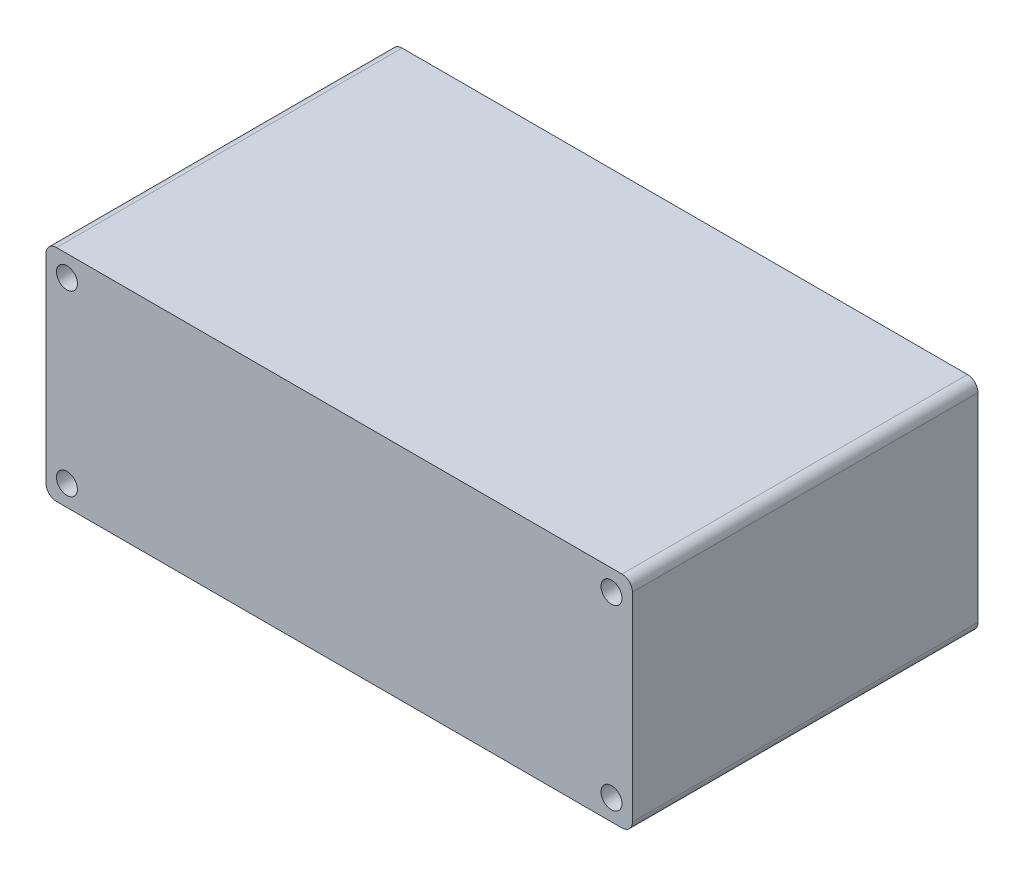
ISO-10303-21;
HEADER;
FILE_DESCRIPTION(('STEP AP214'),'2;1');
FILE_NAME('part.step','',(''),(''),'','','');
FILE_SCHEMA(('AUTOMOTIVE_DESIGN { 1 0 10303 214 1 1 1 1 }'));
ENDSEC;
DATA;
#1=APPLICATION_CONTEXT('core data for automotive mechanical design processes');
#2=APPLICATION_PROTOCOL_DEFINITION('international standard','automotive_design',2000,#1);
#3=PRODUCT_CONTEXT('',#1,'mechanical');
#4=PRODUCT('Part','Part','',(#3));
#5=PRODUCT_RELATED_PRODUCT_CATEGORY('part','',(#4));
#6=PRODUCT_DEFINITION_FORMATION('','',#4);
#7=PRODUCT_DEFINITION_CONTEXT('part definition',#1,'design');
#8=PRODUCT_DEFINITION('design','',#6,#7);
#9=PRODUCT_DEFINITION_SHAPE('','',#8);
#10=(LENGTH_UNIT() NAMED_UNIT(*) SI_UNIT(.MILLI.,.METRE.));
#11=(NAMED_UNIT(*) PLANE_ANGLE_UNIT() SI_UNIT($,.RADIAN.));
#12=(NAMED_UNIT(*) SI_UNIT($,.STERADIAN.) SOLID_ANGLE_UNIT());
#13=UNCERTAINTY_MEASURE_WITH_UNIT(LENGTH_MEASURE(1.E-05),#10,'distance_accuracy_value','');
#14=(GEOMETRIC_REPRESENTATION_CONTEXT(3) GLOBAL_UNCERTAINTY_ASSIGNED_CONTEXT((#13)) GLOBAL_UNIT_ASSIGNED_CONTEXT((#10,
#11,#12)) REPRESENTATION_CONTEXT('',''));
#15=CARTESIAN_POINT('',(0.,0.,0.));
#16=DIRECTION('',(0.,0.,1.));
#17=DIRECTION('',(1.,0.,0.));
#18=AXIS2_PLACEMENT_3D('',#15,#16,#17);
#19=CARTESIAN_POINT('',(141.,-2.0000000000002,0.));
#20=DIRECTION('',(0.,0.,1.));
#21=DIRECTION('',(1.,0.,0.));
#22=AXIS2_PLACEMENT_3D('',#19,#20,#21);
#23=PLANE('',#22);
#24=CARTESIAN_POINT('',(141.,-2.0000000000002,0.));
#25=DIRECTION('',(0.,0.,1.));
#26=DIRECTION('',(1.,0.,0.));
#27=AXIS2_PLACEMENT_3D('',#24,#25,#26);
#28=CIRCLE('',#27,1.);
#29=CARTESIAN_POINT('',(142.,-2.0000000000002,0.));
#30=VERTEX_POINT('',#29);
#31=CARTESIAN_POINT('',(141.,-1.00000000000019,0.));
#32=VERTEX_POINT('',#31);
#33=EDGE_CURVE('E211',#30,#32,#28,.T.);
#34=ORIENTED_EDGE('',*,*,#33,.F.);
#35=DIRECTION('',(0.,1.,0.));
#36=VECTOR('',#35,1.);
#37=CARTESIAN_POINT('',(142.,-21.0000000000002,0.));
#38=LINE('',#37,#36);
#39=CARTESIAN_POINT('',(142.,-21.0000000000002,0.));
#40=VERTEX_POINT('',#39);
#41=EDGE_CURVE('E225',#40,#30,#38,.T.);
#42=ORIENTED_EDGE('',*,*,#41,.F.);
#43=CARTESIAN_POINT('',(141.,-21.0000000000002,0.));
#44=DIRECTION('',(0.,0.,1.));
#45=DIRECTION('',(1.,0.,0.));
#46=AXIS2_PLACEMENT_3D('',#43,#44,#45);
#47=CIRCLE('',#46,1.);
#48=CARTESIAN_POINT('',(141.,-22.0000000000002,0.));
#49=VERTEX_POINT('',#48);
#50=EDGE_CURVE('E223',#49,#40,#47,.T.);
#51=ORIENTED_EDGE('',*,*,#50,.F.);
#52=DIRECTION('',(1.,0.,0.));
#53=VECTOR('',#52,1.);
#54=CARTESIAN_POINT('',(141.,-22.0000000000002,0.));
#55=LINE('',#54,#53);
#56=CARTESIAN_POINT('',(86.9999999999996,-22.0000000000002,0.));
#57=VERTEX_POINT('',#56);
#58=EDGE_CURVE('E221',#57,#49,#55,.T.);
#59=ORIENTED_EDGE('',*,*,#58,.F.);
#60=CARTESIAN_POINT('',(86.9999999999996,-21.0000000000002,0.));
#61=DIRECTION('',(0.,0.,1.));
#62=DIRECTION('',(-1.,0.,0.));
#63=AXIS2_PLACEMENT_3D('',#60,#61,#62);
#64=CIRCLE('',#63,1.);
#65=CARTESIAN_POINT('',(85.9999999999996,-21.0000000000002,0.));
#66=VERTEX_POINT('',#65);
#67=EDGE_CURVE('E130',#66,#57,#64,.T.);
#68=ORIENTED_EDGE('',*,*,#67,.F.);
#69=DIRECTION('',(0.,-1.,0.));
#70=VECTOR('',#69,1.);
#71=CARTESIAN_POINT('',(85.9999999999996,-21.0000000000002,0.));
#72=LINE('',#71,#70);
#73=CARTESIAN_POINT('',(85.9999999999996,-2.0000000000002,0.));
#74=VERTEX_POINT('',#73);
#75=EDGE_CURVE('E218',#74,#66,#72,.T.);
#76=ORIENTED_EDGE('',*,*,#75,.F.);
#77=CARTESIAN_POINT('',(86.9999999999996,-2.0000000000002,0.));
#78=DIRECTION('',(0.,0.,1.));
#79=DIRECTION('',(1.,0.,0.));
#80=AXIS2_PLACEMENT_3D('',#77,#78,#79);
#81=CIRCLE('',#80,1.);
#82=CARTESIAN_POINT('',(86.9999999999996,-1.0000000000002,0.));
#83=VERTEX_POINT('',#82);
#84=EDGE_CURVE('E216',#83,#74,#81,.T.);
#85=ORIENTED_EDGE('',*,*,#84,.F.);
#86=DIRECTION('',(-1.,0.,0.));
#87=VECTOR('',#86,1.);
#88=CARTESIAN_POINT('',(141.,-1.00000000000019,0.));
#89=LINE('',#88,#87);
#90=EDGE_CURVE('E214',#32,#83,#89,.T.);
#91=ORIENTED_EDGE('',*,*,#90,.F.);
#92=EDGE_LOOP('',(#34,#42,#51,#59,#68,#76,#85,#91));
#93=FACE_BOUND('',#92,.T.);
#94=CARTESIAN_POINT('',(131.5,-11.5000000000002,0.));
#95=DIRECTION('',(0.,0.,1.));
#96=DIRECTION('',(1.,0.,0.));
#97=AXIS2_PLACEMENT_3D('',#94,#95,#96);
#98=CIRCLE('',#97,9.50000000000001);
#99=CARTESIAN_POINT('',(131.5,-21.0000000000002,0.));
#100=VERTEX_POINT('',#99);
#101=CARTESIAN_POINT('',(131.5,-2.00000000000019,0.));
#102=VERTEX_POINT('',#101);
#103=EDGE_CURVE('E55',#100,#102,#98,.T.);
#104=ORIENTED_EDGE('',*,*,#103,.T.);
#105=DIRECTION('',(-1.,0.,0.));
#106=VECTOR('',#105,1.);
#107=CARTESIAN_POINT('',(131.5,-2.00000000000019,0.));
#108=LINE('',#107,#106);
#109=CARTESIAN_POINT('',(96.4999999999996,-2.0000000000002,0.));
#110=VERTEX_POINT('',#109);
#111=EDGE_CURVE('E196',#102,#110,#108,.T.);
#112=ORIENTED_EDGE('',*,*,#111,.T.);
#113=CARTESIAN_POINT('',(96.4999999999996,-11.5000000000002,0.));
#114=DIRECTION('',(0.,0.,1.));
#115=DIRECTION('',(1.,0.,0.));
#116=AXIS2_PLACEMENT_3D('',#113,#114,#115);
#117=CIRCLE('',#116,9.5);
#118=CARTESIAN_POINT('',(96.4999999999996,-21.0000000000002,0.));
#119=VERTEX_POINT('',#118);
#120=EDGE_CURVE('E199',#110,#119,#117,.T.);
#121=ORIENTED_EDGE('',*,*,#120,.T.);
#122=DIRECTION('',(1.,0.,0.));
#123=VECTOR('',#122,1.);
#124=CARTESIAN_POINT('',(131.5,-21.0000000000002,0.));
#125=LINE('',#124,#123);
#126=EDGE_CURVE('E187',#119,#100,#125,.T.);
#127=ORIENTED_EDGE('',*,*,#126,.T.);
#128=EDGE_LOOP('',(#104,#112,#121,#127));
#129=FACE_BOUND('',#128,.T.);
#130=CARTESIAN_POINT('',(140.,-3.00000000000001,0.));
#131=DIRECTION('',(0.,0.,1.));
#132=DIRECTION('',(1.,0.,0.));
#133=AXIS2_PLACEMENT_3D('',#130,#131,#132);
#134=CIRCLE('',#133,0.999999999999998);
#135=CARTESIAN_POINT('',(141.,-3.00000000000001,0.));
#136=VERTEX_POINT('',#135);
#137=EDGE_CURVE('E180',#136,#136,#134,.T.);
#138=ORIENTED_EDGE('',*,*,#137,.T.);
#139=EDGE_LOOP('',(#138));
#140=FACE_BOUND('',#139,.T.);
#141=CARTESIAN_POINT('',(87.9999999999988,-3.00000000000001,0.));
#142=DIRECTION('',(0.,0.,1.));
#143=DIRECTION('',(1.,0.,0.));
#144=AXIS2_PLACEMENT_3D('',#141,#142,#143);
#145=CIRCLE('',#144,0.999999999999998);
#146=CARTESIAN_POINT('',(88.9999999999988,-3.00000000000001,0.));
#147=VERTEX_POINT('',#146);
#148=EDGE_CURVE('E177',#147,#147,#145,.T.);
#149=ORIENTED_EDGE('',*,*,#148,.T.);
#150=EDGE_LOOP('',(#149));
#151=FACE_BOUND('',#150,.T.);
#152=CARTESIAN_POINT('',(87.9999999999988,-20.0000000000002,0.));
#153=DIRECTION('',(0.,0.,1.));
#154=DIRECTION('',(1.,0.,0.));
#155=AXIS2_PLACEMENT_3D('',#152,#153,#154);
#156=CIRCLE('',#155,0.999999999999998);
#157=CARTESIAN_POINT('',(88.9999999999988,-20.0000000000002,0.));
#158=VERTEX_POINT('',#157);
#159=EDGE_CURVE('E174',#158,#158,#156,.T.);
#160=ORIENTED_EDGE('',*,*,#159,.T.);
#161=EDGE_LOOP('',(#160));
#162=FACE_BOUND('',#161,.T.);
#163=CARTESIAN_POINT('',(140.,-20.0000000000002,0.));
#164=DIRECTION('',(0.,0.,1.));
#165=DIRECTION('',(1.,0.,0.));
#166=AXIS2_PLACEMENT_3D('',#163,#164,#165);
#167=CIRCLE('',#166,0.999999999999998);
#168=CARTESIAN_POINT('',(141.,-20.0000000000002,0.));
#169=VERTEX_POINT('',#168);
#170=EDGE_CURVE('E171',#169,#169,#167,.T.);
#171=ORIENTED_EDGE('',*,*,#170,.T.);
#172=EDGE_LOOP('',(#171));
#173=FACE_BOUND('',#172,.T.);
#174=ADVANCED_FACE('F32',(#93,#129,#140,#151,#162,#173),#23,.F.);
#175=CARTESIAN_POINT('',(141.,-2.0000000000002,30.));
#176=DIRECTION('',(0.,0.,-1.));
#177=DIRECTION('',(-1.,0.,0.));
#178=AXIS2_PLACEMENT_3D('',#175,#176,#177);
#179=CYLINDRICAL_SURFACE('',#178,1.);
#180=ORIENTED_EDGE('',*,*,#33,.T.);
#181=DIRECTION('',(0.,0.,-1.));
#182=VECTOR('',#181,1.);
#183=CARTESIAN_POINT('',(141.,-1.00000000000019,30.));
#184=LINE('',#183,#182);
#185=CARTESIAN_POINT('',(141.,-1.00000000000019,33.));
#186=VERTEX_POINT('',#185);
#187=EDGE_CURVE('E11',#186,#32,#184,.T.);
#188=ORIENTED_EDGE('',*,*,#187,.F.);
#189=CARTESIAN_POINT('',(141.,-2.0000000000002,33.));
#190=DIRECTION('',(0.,0.,1.));
#191=DIRECTION('',(1.,0.,0.));
#192=AXIS2_PLACEMENT_3D('',#189,#190,#191);
#193=CIRCLE('',#192,1.);
#194=CARTESIAN_POINT('',(142.,-2.0000000000002,33.));
#195=VERTEX_POINT('',#194);
#196=EDGE_CURVE('E162',#195,#186,#193,.T.);
#197=ORIENTED_EDGE('',*,*,#196,.F.);
#198=DIRECTION('',(0.,0.,-1.));
#199=VECTOR('',#198,1.);
#200=CARTESIAN_POINT('',(142.,-2.0000000000002,30.));
#201=LINE('',#200,#199);
#202=EDGE_CURVE('E227',#195,#30,#201,.T.);
#203=ORIENTED_EDGE('',*,*,#202,.T.);
#204=EDGE_LOOP('',(#180,#188,#197,#203));
#205=FACE_BOUND('',#204,.T.);
#206=ADVANCED_FACE('F34',(#205),#179,.T.);
#207=CARTESIAN_POINT('',(141.,-1.00000000000019,30.));
#208=DIRECTION('',(0.,-1.,0.));
#209=DIRECTION('',(1.,0.,0.));
#210=AXIS2_PLACEMENT_3D('',#207,#208,#209);
#211=PLANE('',#210);
#212=ORIENTED_EDGE('',*,*,#90,.T.);
#213=DIRECTION('',(0.,0.,-1.));
#214=VECTOR('',#213,1.);
#215=CARTESIAN_POINT('',(86.9999999999996,-1.0000000000002,30.));
#216=LINE('',#215,#214);
#217=CARTESIAN_POINT('',(86.9999999999996,-1.00000000000019,33.));
#218=VERTEX_POINT('',#217);
#219=EDGE_CURVE('E40',#218,#83,#216,.T.);
#220=ORIENTED_EDGE('',*,*,#219,.F.);
#221=DIRECTION('',(-1.,0.,0.));
#222=VECTOR('',#221,1.);
#223=CARTESIAN_POINT('',(141.,-1.00000000000019,33.));
#224=LINE('',#223,#222);
#225=EDGE_CURVE('E165',#186,#218,#224,.T.);
#226=ORIENTED_EDGE('',*,*,#225,.F.);
#227=ORIENTED_EDGE('',*,*,#187,.T.);
#228=EDGE_LOOP('',(#212,#220,#226,#227));
#229=FACE_BOUND('',#228,.T.);
#230=ADVANCED_FACE('F251',(#229),#211,.F.);
#231=CARTESIAN_POINT('',(86.9999999999996,-2.0000000000002,30.));
#232=DIRECTION('',(0.,0.,-1.));
#233=DIRECTION('',(-1.,0.,0.));
#234=AXIS2_PLACEMENT_3D('',#231,#232,#233);
#235=CYLINDRICAL_SURFACE('',#234,1.);
#236=ORIENTED_EDGE('',*,*,#84,.T.);
#237=DIRECTION('',(0.,0.,-1.));
#238=VECTOR('',#237,1.);
#239=CARTESIAN_POINT('',(85.9999999999996,-2.0000000000002,30.));
#240=LINE('',#239,#238);
#241=CARTESIAN_POINT('',(85.9999999999996,-2.0000000000002,33.));
#242=VERTEX_POINT('',#241);
#243=EDGE_CURVE('E235',#242,#74,#240,.T.);
#244=ORIENTED_EDGE('',*,*,#243,.F.);
#245=CARTESIAN_POINT('',(86.9999999999996,-2.0000000000002,33.));
#246=DIRECTION('',(0.,0.,1.));
#247=DIRECTION('',(1.,0.,0.));
#248=AXIS2_PLACEMENT_3D('',#245,#246,#247);
#249=CIRCLE('',#248,1.);
#250=EDGE_CURVE('E168',#218,#242,#249,.T.);
#251=ORIENTED_EDGE('',*,*,#250,.F.);
#252=ORIENTED_EDGE('',*,*,#219,.T.);
#253=EDGE_LOOP('',(#236,#244,#251,#252));
#254=FACE_BOUND('',#253,.T.);
#255=ADVANCED_FACE('F241',(#254),#235,.T.);
#256=CARTESIAN_POINT('',(85.9999999999996,-21.0000000000002,30.));
#257=DIRECTION('',(1.,0.,0.));
#258=DIRECTION('',(0.,1.,0.));
#259=AXIS2_PLACEMENT_3D('',#256,#257,#258);
#260=PLANE('',#259);
#261=CARTESIAN_POINT('',(85.9999999999996,-11.5000000000002,23.));
#262=DIRECTION('',(-1.,0.,0.));
#263=DIRECTION('',(0.,0.,1.));
#264=AXIS2_PLACEMENT_3D('',#261,#262,#263);
#265=CIRCLE('',#264,5.);
#266=CARTESIAN_POINT('',(85.9999999999996,-11.5000000000002,28.));
#267=VERTEX_POINT('',#266);
#268=EDGE_CURVE('E325',#267,#267,#265,.T.);
#269=ORIENTED_EDGE('',*,*,#268,.F.);
#270=EDGE_LOOP('',(#269));
#271=FACE_BOUND('',#270,.T.);
#272=ORIENTED_EDGE('',*,*,#75,.T.);
#273=DIRECTION('',(0.,0.,-1.));
#274=VECTOR('',#273,1.);
#275=CARTESIAN_POINT('',(85.9999999999996,-21.0000000000002,30.));
#276=LINE('',#275,#274);
#277=CARTESIAN_POINT('',(85.9999999999996,-21.0000000000002,33.));
#278=VERTEX_POINT('',#277);
#279=EDGE_CURVE('E133',#278,#66,#276,.T.);
#280=ORIENTED_EDGE('',*,*,#279,.F.);
#281=DIRECTION('',(0.,-1.,0.));
#282=VECTOR('',#281,1.);
#283=CARTESIAN_POINT('',(85.9999999999996,-2.0000000000002,33.));
#284=LINE('',#283,#282);
#285=EDGE_CURVE('E150',#242,#278,#284,.T.);
#286=ORIENTED_EDGE('',*,*,#285,.F.);
#287=ORIENTED_EDGE('',*,*,#243,.T.);
#288=EDGE_LOOP('',(#272,#280,#286,#287));
#289=FACE_BOUND('',#288,.T.);
#290=ADVANCED_FACE('F249',(#271,#289),#260,.F.);
#291=CARTESIAN_POINT('',(86.9999999999996,-21.0000000000002,30.));
#292=DIRECTION('',(0.,0.,-1.));
#293=DIRECTION('',(-1.,0.,0.));
#294=AXIS2_PLACEMENT_3D('',#291,#292,#293);
#295=CYLINDRICAL_SURFACE('',#294,1.);
#296=ORIENTED_EDGE('',*,*,#67,.T.);
#297=DIRECTION('',(0.,0.,-1.));
#298=VECTOR('',#297,1.);
#299=CARTESIAN_POINT('',(86.9999999999996,-22.0000000000002,30.));
#300=LINE('',#299,#298);
#301=CARTESIAN_POINT('',(86.9999999999996,-22.0000000000002,33.));
#302=VERTEX_POINT('',#301);
#303=EDGE_CURVE('E123',#302,#57,#300,.T.);
#304=ORIENTED_EDGE('',*,*,#303,.F.);
#305=CARTESIAN_POINT('',(86.9999999999996,-21.0000000000002,33.));
#306=DIRECTION('',(0.,0.,1.));
#307=DIRECTION('',(1.,0.,0.));
#308=AXIS2_PLACEMENT_3D('',#305,#306,#307);
#309=CIRCLE('',#308,1.);
#310=EDGE_CURVE('E128',#278,#302,#309,.T.);
#311=ORIENTED_EDGE('',*,*,#310,.F.);
#312=ORIENTED_EDGE('',*,*,#279,.T.);
#313=EDGE_LOOP('',(#296,#304,#311,#312));
#314=FACE_BOUND('',#313,.T.);
#315=ADVANCED_FACE('F125',(#314),#295,.T.);
#316=CARTESIAN_POINT('',(141.,-22.0000000000002,30.));
#317=DIRECTION('',(0.,1.,0.));
#318=DIRECTION('',(-1.,0.,0.));
#319=AXIS2_PLACEMENT_3D('',#316,#317,#318);
#320=PLANE('',#319);
#321=ORIENTED_EDGE('',*,*,#58,.T.);
#322=DIRECTION('',(0.,0.,-1.));
#323=VECTOR('',#322,1.);
#324=CARTESIAN_POINT('',(141.,-22.0000000000002,30.));
#325=LINE('',#324,#323);
#326=CARTESIAN_POINT('',(141.,-22.0000000000002,33.));
#327=VERTEX_POINT('',#326);
#328=EDGE_CURVE('E134',#327,#49,#325,.T.);
#329=ORIENTED_EDGE('',*,*,#328,.F.);
#330=DIRECTION('',(1.,0.,0.));
#331=VECTOR('',#330,1.);
#332=CARTESIAN_POINT('',(86.9999999999996,-22.0000000000002,33.));
#333=LINE('',#332,#331);
#334=EDGE_CURVE('E137',#302,#327,#333,.T.);
#335=ORIENTED_EDGE('',*,*,#334,.F.);
#336=ORIENTED_EDGE('',*,*,#303,.T.);
#337=EDGE_LOOP('',(#321,#329,#335,#336));
#338=FACE_BOUND('',#337,.T.);
#339=ADVANCED_FACE('F138',(#338),#320,.F.);
#340=CARTESIAN_POINT('',(141.,-21.0000000000002,30.));
#341=DIRECTION('',(0.,0.,-1.));
#342=DIRECTION('',(-1.,0.,0.));
#343=AXIS2_PLACEMENT_3D('',#340,#341,#342);
#344=CYLINDRICAL_SURFACE('',#343,1.);
#345=ORIENTED_EDGE('',*,*,#50,.T.);
#346=DIRECTION('',(0.,0.,-1.));
#347=VECTOR('',#346,1.);
#348=CARTESIAN_POINT('',(142.,-21.0000000000002,30.));
#349=LINE('',#348,#347);
#350=CARTESIAN_POINT('',(142.,-21.0000000000002,33.));
#351=VERTEX_POINT('',#350);
#352=EDGE_CURVE('E230',#351,#40,#349,.T.);
#353=ORIENTED_EDGE('',*,*,#352,.F.);
#354=CARTESIAN_POINT('',(141.,-21.0000000000002,33.));
#355=DIRECTION('',(0.,0.,1.));
#356=DIRECTION('',(1.,0.,0.));
#357=AXIS2_PLACEMENT_3D('',#354,#355,#356);
#358=CIRCLE('',#357,1.);
#359=EDGE_CURVE('E143',#327,#351,#358,.T.);
#360=ORIENTED_EDGE('',*,*,#359,.F.);
#361=ORIENTED_EDGE('',*,*,#328,.T.);
#362=EDGE_LOOP('',(#345,#353,#360,#361));
#363=FACE_BOUND('',#362,.T.);
#364=ADVANCED_FACE('F259',(#363),#344,.T.);
#365=CARTESIAN_POINT('',(142.,-21.0000000000002,30.));
#366=DIRECTION('',(-1.,0.,0.));
#367=DIRECTION('',(0.,0.,1.));
#368=AXIS2_PLACEMENT_3D('',#365,#366,#367);
#369=PLANE('',#368);
#370=ORIENTED_EDGE('',*,*,#41,.T.);
#371=ORIENTED_EDGE('',*,*,#202,.F.);
#372=DIRECTION('',(0.,1.,0.));
#373=VECTOR('',#372,1.);
#374=CARTESIAN_POINT('',(142.,-21.0000000000002,33.));
#375=LINE('',#374,#373);
#376=EDGE_CURVE('E159',#351,#195,#375,.T.);
#377=ORIENTED_EDGE('',*,*,#376,.F.);
#378=ORIENTED_EDGE('',*,*,#352,.T.);
#379=EDGE_LOOP('',(#370,#371,#377,#378));
#380=FACE_BOUND('',#379,.T.);
#381=ADVANCED_FACE('F256',(#380),#369,.F.);
#382=CARTESIAN_POINT('',(131.5,-11.5000000000002,30.));
#383=DIRECTION('',(0.,0.,-1.));
#384=DIRECTION('',(-1.,0.,0.));
#385=AXIS2_PLACEMENT_3D('',#382,#383,#384);
#386=CYLINDRICAL_SURFACE('',#385,9.50000000000001);
#387=ORIENTED_EDGE('',*,*,#103,.F.);
#388=DIRECTION('',(0.,0.,-1.));
#389=VECTOR('',#388,1.);
#390=CARTESIAN_POINT('',(131.5,-21.0000000000002,30.));
#391=LINE('',#390,#389);
#392=CARTESIAN_POINT('',(131.5,-21.0000000000002,30.));
#393=VERTEX_POINT('',#392);
#394=EDGE_CURVE('E194',#393,#100,#391,.T.);
#395=ORIENTED_EDGE('',*,*,#394,.F.);
#396=CARTESIAN_POINT('',(131.5,-11.5000000000002,30.));
#397=DIRECTION('',(0.,0.,1.));
#398=DIRECTION('',(1.,0.,0.));
#399=AXIS2_PLACEMENT_3D('',#396,#397,#398);
#400=CIRCLE('',#399,9.50000000000001);
#401=CARTESIAN_POINT('',(131.5,-2.00000000000019,30.));
#402=VERTEX_POINT('',#401);
#403=EDGE_CURVE('E183',#393,#402,#400,.T.);
#404=ORIENTED_EDGE('',*,*,#403,.T.);
#405=DIRECTION('',(0.,0.,-1.));
#406=VECTOR('',#405,1.);
#407=CARTESIAN_POINT('',(131.5,-2.00000000000019,30.));
#408=LINE('',#407,#406);
#409=EDGE_CURVE('E209',#402,#102,#408,.T.);
#410=ORIENTED_EDGE('',*,*,#409,.T.);
#411=EDGE_LOOP('',(#387,#395,#404,#410));
#412=FACE_BOUND('',#411,.T.);
#413=ADVANCED_FACE('F266',(#412),#386,.F.);
#414=CARTESIAN_POINT('',(131.5,-2.00000000000019,30.));
#415=DIRECTION('',(0.,-1.,0.));
#416=DIRECTION('',(1.,0.,0.));
#417=AXIS2_PLACEMENT_3D('',#414,#415,#416);
#418=PLANE('',#417);
#419=ORIENTED_EDGE('',*,*,#111,.F.);
#420=ORIENTED_EDGE('',*,*,#409,.F.);
#421=DIRECTION('',(-1.,0.,0.));
#422=VECTOR('',#421,1.);
#423=CARTESIAN_POINT('',(131.5,-2.00000000000019,30.));
#424=LINE('',#423,#422);
#425=CARTESIAN_POINT('',(96.4999999999996,-2.0000000000002,30.));
#426=VERTEX_POINT('',#425);
#427=EDGE_CURVE('E186',#402,#426,#424,.T.);
#428=ORIENTED_EDGE('',*,*,#427,.T.);
#429=DIRECTION('',(0.,0.,-1.));
#430=VECTOR('',#429,1.);
#431=CARTESIAN_POINT('',(96.4999999999996,-2.0000000000002,30.));
#432=LINE('',#431,#430);
#433=EDGE_CURVE('E207',#426,#110,#432,.T.);
#434=ORIENTED_EDGE('',*,*,#433,.T.);
#435=EDGE_LOOP('',(#419,#420,#428,#434));
#436=FACE_BOUND('',#435,.T.);
#437=ADVANCED_FACE('F277',(#436),#418,.T.);
#438=CARTESIAN_POINT('',(96.4999999999996,-11.5000000000002,30.));
#439=DIRECTION('',(0.,0.,-1.));
#440=DIRECTION('',(-1.,0.,0.));
#441=AXIS2_PLACEMENT_3D('',#438,#439,#440);
#442=CYLINDRICAL_SURFACE('',#441,9.5);
#443=CARTESIAN_POINT('',(86.9999999999996,-11.5000000000002,28.));
#444=CARTESIAN_POINT('',(86.9999997416909,-11.369357982565,28.000000317987));
#445=CARTESIAN_POINT('',(87.0027006256965,-11.2387196189047,27.9948744609087));
#446=CARTESIAN_POINT('',(87.0134345601647,-10.9784159482028,27.974434606502));
#447=CARTESIAN_POINT('',(87.0214695492115,-10.8487510122688,27.9591169051265));
#448=CARTESIAN_POINT('',(87.0426786998915,-10.5912750976958,27.9184577717431));
#449=CARTESIAN_POINT('',(87.055858944038,-10.4634664997114,27.8931044755615));
#450=CARTESIAN_POINT('',(87.0870308205997,-10.2107231946798,27.8326657472864));
#451=CARTESIAN_POINT('',(87.1050244191008,-10.0857896847024,27.7975763381148));
#452=CARTESIAN_POINT('',(87.1452945183149,-9.84021285140227,27.7182284077017));
#453=CARTESIAN_POINT('',(87.1675514871284,-9.71955282738382,27.6740116328295));
#454=CARTESIAN_POINT('',(87.2158831042959,-9.48261984508039,27.5767455040224));
#455=CARTESIAN_POINT('',(87.2419591927767,-9.36634856261071,27.5236928171717));
#456=CARTESIAN_POINT('',(87.3250410975837,-9.02517594142102,27.3520070644262));
#457=CARTESIAN_POINT('',(87.3869439211606,-8.80766246380159,27.2207635075518));
#458=CARTESIAN_POINT('',(87.5228802360599,-8.38322843142509,26.9189251335603));
#459=CARTESIAN_POINT('',(87.5974404156811,-8.17791288549695,26.7463284379279));
#460=CARTESIAN_POINT('',(87.7487498399386,-7.79762972748011,26.3710445731553));
#461=CARTESIAN_POINT('',(87.8255008837125,-7.62268794491385,26.1683320630222));
#462=CARTESIAN_POINT('',(87.9804122713542,-7.29253514135062,25.7169811461883));
#463=CARTESIAN_POINT('',(88.0580995640755,-7.1404264830213,25.4658687845684));
#464=CARTESIAN_POINT('',(88.1622865134793,-6.94610530058873,25.0697212185028));
#465=CARTESIAN_POINT('',(88.1949668797,-6.88695799498188,24.9343778106149));
#466=CARTESIAN_POINT('',(88.2549580125497,-6.78057106012335,24.6579732454432));
#467=CARTESIAN_POINT('',(88.2822721088557,-6.73332404178527,24.5169156996451));
#468=CARTESIAN_POINT('',(88.3288700453569,-6.65390599100338,24.2389392756886));
#469=CARTESIAN_POINT('',(88.348544473245,-6.62098641468164,24.1022994853186));
#470=CARTESIAN_POINT('',(88.3812850854201,-6.56669715020189,23.8260278190597));
#471=CARTESIAN_POINT('',(88.3943549677896,-6.54532099807417,23.6863976633251));
#472=CARTESIAN_POINT('',(88.4132971518459,-6.51446420960479,23.4054493467295));
#473=CARTESIAN_POINT('',(88.4191749951584,-6.50497441442767,23.2641325703383));
#474=CARTESIAN_POINT('',(88.4234694742459,-6.49803292392853,22.9810973716733));
#475=CARTESIAN_POINT('',(88.4218869695507,-6.50057984181967,22.8393789975492));
#476=CARTESIAN_POINT('',(88.4120641729757,-6.51649126361064,22.5762405542013));
#477=CARTESIAN_POINT('',(88.4047617726442,-6.52833233256734,22.4546893079688));
#478=CARTESIAN_POINT('',(88.3849137414705,-6.5607958556633,22.2131620772507));
#479=CARTESIAN_POINT('',(88.3723664897901,-6.58142102442671,22.0931865915607));
#480=CARTESIAN_POINT('',(88.3424470812772,-6.63120430331191,21.8556437359922));
#481=CARTESIAN_POINT('',(88.3250752508583,-6.6603618361718,21.7380762037779));
#482=CARTESIAN_POINT('',(88.2860529486796,-6.7268924006772,21.5059994669948));
#483=CARTESIAN_POINT('',(88.2644007835807,-6.76426868439427,21.3914914932322));
#484=CARTESIAN_POINT('',(88.1928977867802,-6.89006272592982,21.0484389586847));
#485=CARTESIAN_POINT('',(88.1371977315442,-6.99104476958744,20.8255782568692));
#486=CARTESIAN_POINT('',(88.0162892131481,-7.22288683555834,20.3989634107722));
#487=CARTESIAN_POINT('',(87.9510765123234,-7.35376018853932,20.1952178486625));
#488=CARTESIAN_POINT('',(87.8072792925433,-7.6633695191085,19.7819125375956));
#489=CARTESIAN_POINT('',(87.7281136621516,-7.84626867179607,19.5756630506423));
#490=CARTESIAN_POINT('',(87.5727340840919,-8.24431677679743,19.1952297788804));
#491=CARTESIAN_POINT('',(87.4965218704981,-8.45948432474821,19.0210646134444));
#492=CARTESIAN_POINT('',(87.3880089875671,-8.80968686550788,18.7829260659371));
#493=CARTESIAN_POINT('',(87.3519345599971,-8.93472433897921,18.7056923919114));
#494=CARTESIAN_POINT('',(87.2836873353092,-9.19191779827393,18.5621610699788));
#495=CARTESIAN_POINT('',(87.2515128813184,-9.32407072644703,18.4958587736205));
#496=CARTESIAN_POINT('',(87.1920152727766,-9.59458725645277,18.3749217991445));
#497=CARTESIAN_POINT('',(87.1646899043586,-9.73294798775563,18.3202817942445));
#498=CARTESIAN_POINT('',(87.1157090110369,-10.0148934618527,18.2233201194964));
#499=CARTESIAN_POINT('',(87.0940527542753,-10.1584775276083,18.1809968595306));
#500=CARTESIAN_POINT('',(87.0587390629045,-10.4367541198983,18.11244534739));
#501=CARTESIAN_POINT('',(87.0445436017214,-10.5711099599366,18.0851246937895));
#502=CARTESIAN_POINT('',(87.0218348424708,-10.8420772650071,18.0415767075658));
#503=CARTESIAN_POINT('',(87.0133209671201,-10.9786884994319,18.0253482479055));
#504=CARTESIAN_POINT('',(87.0022211565531,-11.252963173858,18.0042134039977));
#505=CARTESIAN_POINT('',(86.9996325921481,-11.3906261199746,17.9993019981221));
#506=CARTESIAN_POINT('',(87.0004513917454,-11.6658661920718,18.0008575722021));
#507=CARTESIAN_POINT('',(87.0038584308406,-11.8034433222988,18.0073239355861));
#508=CARTESIAN_POINT('',(87.0160062588043,-12.0652385101462,18.0304705947382));
#509=CARTESIAN_POINT('',(87.0242504264846,-12.1895651797928,18.046200329972));
#510=CARTESIAN_POINT('',(87.0454445481452,-12.4363350781596,18.0868625387109));
#511=CARTESIAN_POINT('',(87.0583959774331,-12.5587777038457,18.1117978973982));
#512=CARTESIAN_POINT('',(87.0887023191738,-12.8009039212565,18.1705942367615));
#513=CARTESIAN_POINT('',(87.1060558566874,-12.9205883617543,18.204452430638));
#514=CARTESIAN_POINT('',(87.1447763549959,-13.15653810145,18.2807542060238));
#515=CARTESIAN_POINT('',(87.1661448556489,-13.2728020689415,18.3232010820304));
#516=CARTESIAN_POINT('',(87.236787930839,-13.6212818744949,18.4652418058309));
#517=CARTESIAN_POINT('',(87.2918111530488,-13.8471118099079,18.5780536847876));
#518=CARTESIAN_POINT('',(87.4122468021073,-14.2771934934631,18.8346594749168));
#519=CARTESIAN_POINT('',(87.4776633758989,-14.4814365740615,18.9784657610457));
#520=CARTESIAN_POINT('',(87.6209228186567,-14.8856536520694,19.310447906929));
#521=CARTESIAN_POINT('',(87.6993481705601,-15.0828907803326,19.5017080512627));
#522=CARTESIAN_POINT('',(87.8551001824513,-15.4439098563229,19.9144274190515));
#523=CARTESIAN_POINT('',(87.9324258245731,-15.6076624764158,20.1359128348617));
#524=CARTESIAN_POINT('',(88.0435849296521,-15.8297240886234,20.4950012632679));
#525=CARTESIAN_POINT('',(88.0808430196574,-15.9015256375686,20.6233782229586));
#526=CARTESIAN_POINT('',(88.1513813547111,-16.0338926837257,20.8868222888128));
#527=CARTESIAN_POINT('',(88.1846633954026,-16.0944632598871,21.0218863357094));
#528=CARTESIAN_POINT('',(88.2459406774029,-16.2036612098455,21.2977765386425));
#529=CARTESIAN_POINT('',(88.2739406596838,-16.2522993056758,21.4385973881062));
#530=CARTESIAN_POINT('',(88.3234750882516,-16.3370296519188,21.7250722101723));
#531=CARTESIAN_POINT('',(88.345010656948,-16.3731240804474,21.8707253388682));
#532=CARTESIAN_POINT('',(88.3788461534565,-16.4292824876749,22.1511338269376));
#533=CARTESIAN_POINT('',(88.3918437101488,-16.4505696631602,22.2855605511812));
#534=CARTESIAN_POINT('',(88.4111939463369,-16.4821243756629,22.5561695610645));
#535=CARTESIAN_POINT('',(88.4175474981503,-16.4923933593066,22.6923516138627));
#536=CARTESIAN_POINT('',(88.4233285916889,-16.5017406429869,22.9651786092896));
#537=CARTESIAN_POINT('',(88.4227595739214,-16.5008245020136,23.1018232882369));
#538=CARTESIAN_POINT('',(88.4147295081426,-16.4878311052638,23.3743690671181));
#539=CARTESIAN_POINT('',(88.407268872448,-16.4757545172028,23.5102702110476));
#540=CARTESIAN_POINT('',(88.3870333154893,-16.4426811281663,23.764438938645));
#541=CARTESIAN_POINT('',(88.3749759189488,-16.4228827013439,23.8829219925506));
#542=CARTESIAN_POINT('',(88.3461368967532,-16.3749656359118,24.1176199267016));
#543=CARTESIAN_POINT('',(88.3293538370409,-16.3468444715384,24.2338341069657));
#544=CARTESIAN_POINT('',(88.2726625693214,-16.2504251444418,24.5780169445681));
#545=CARTESIAN_POINT('',(88.2263992746317,-16.1700511513801,24.8016762481889));
#546=CARTESIAN_POINT('',(88.118518401326,-15.9737047773044,25.2470247968919));
#547=CARTESIAN_POINT('',(88.0560947796775,-15.8557487126097,25.4676294177869));
#548=CARTESIAN_POINT('',(87.924016167517,-15.5895681326081,25.8874264547227));
#549=CARTESIAN_POINT('',(87.8543572955347,-15.4413273288902,26.0866072597595));
#550=CARTESIAN_POINT('',(87.7040387279336,-15.0946567175505,26.4868354003536));
#551=CARTESIAN_POINT('',(87.6232010797827,-14.8921092164834,26.6842601145758));
#552=CARTESIAN_POINT('',(87.468220749267,-14.4547662115223,27.0434285524749));
#553=CARTESIAN_POINT('',(87.3940822400521,-14.2199508331772,27.2051501245881));
#554=CARTESIAN_POINT('',(87.2930308321505,-13.8450064943989,27.4184003306757));
#555=CARTESIAN_POINT('',(87.2607587247618,-13.714757400119,27.4851308248968));
#556=CARTESIAN_POINT('',(87.2008724823937,-13.448040042067,27.6072350656036));
#557=CARTESIAN_POINT('',(87.1732560548708,-13.3115748815003,27.6626144045263));
#558=CARTESIAN_POINT('',(87.1235557276995,-13.0336830387828,27.7612515491197));
#559=CARTESIAN_POINT('',(87.1014604910497,-12.8922672147836,27.8045342156587));
#560=CARTESIAN_POINT('',(87.0634272406024,-12.605440906624,27.8785156219484));
#561=CARTESIAN_POINT('',(87.0474857368295,-12.4600327369201,27.9092214949992));
#562=CARTESIAN_POINT('',(87.0233591649367,-12.1792503959727,27.955509446457));
#563=CARTESIAN_POINT('',(87.0146208484381,-12.0441011091201,27.9721731149942));
#564=CARTESIAN_POINT('',(87.0029413468626,-11.7726332366459,27.9944183288481));
#565=CARTESIAN_POINT('',(87.0000002695243,-11.6363146293406,27.9999996682057));
#566=CARTESIAN_POINT('',(86.9999999999996,-11.5000000000002,28.));
#567=B_SPLINE_CURVE_WITH_KNOTS('',3,(#443,#444,#445,#446,#447,#448,#449,#450,#451,#452,#453,
#454,#455,#456,#457,#458,#459,#460,#461,#462,#463,#464,#465,#466,#467,#468,#469,#470,#471,#472,
#473,#474,#475,#476,#477,#478,#479,#480,#481,#482,#483,#484,#485,#486,#487,#488,#489,#490,#491,
#492,#493,#494,#495,#496,#497,#498,#499,#500,#501,#502,#503,#504,#505,#506,#507,#508,#509,#510,
#511,#512,#513,#514,#515,#516,#517,#518,#519,#520,#521,#522,#523,#524,#525,#526,#527,#528,#529,
#530,#531,#532,#533,#534,#535,#536,#537,#538,#539,#540,#541,#542,#543,#544,#545,#546,#547,#548,
#549,#550,#551,#552,#553,#554,#555,#556,#557,#558,#559,#560,#561,#562,#563,#564,#565,#566),
.UNSPECIFIED.,.T.,.F.,(4,2,2,2,2,2,2,2,2,2,2,2,2,2,2,2,2,2,2,2,2,2,2,2,2,2,2,2,2,2,2,2,2,2,2,2,
2,2,2,2,2,2,2,2,2,2,2,2,2,2,2,2,2,2,2,2,2,2,2,2,2,4),(0.,0.391792234766459,0.783726937376354,
1.17612637938022,1.56868634813667,1.9594891182048,2.35043963476482,3.13153974791818,
3.96336059711627,4.79588538958413,5.70185853857095,6.15514333994222,6.60814599152593,
7.03328551901218,7.4581867336586,7.88276034589863,8.30728504289537,8.67388499400747,
9.0405983208849,9.40728684329943,9.77412072236209,10.5237287019369,11.2736716402267,
12.1305026186323,12.9878292827807,13.4413063432077,13.8945900672075,14.3476663075088,
14.8006840287361,15.2136370748122,15.6265481560021,16.0392759840608,16.4519814467071,
16.8283085214851,17.2047536431578,17.5810813317142,17.9575536488584,18.7291877806219,
19.5011305708673,20.3547282709444,21.2090704279473,21.6637716019805,22.1182666436425,
22.5723517866476,23.0263580416498,23.435929262362,23.8454467021029,24.2547606205802,
24.6640500519112,25.0258225662958,25.3877049832792,26.1110184000081,26.8816169531074,
27.6526310629693,28.5313005688989,29.4105137116298,29.8595817113886,30.3084279316799,
30.75634479159,31.2040072492434,31.6128039120318,32.0216081720173),.UNSPECIFIED.);
#568=CARTESIAN_POINT('',(86.9999999999996,-11.5000000000002,28.));
#569=VERTEX_POINT('',#568);
#570=EDGE_CURVE('E318',#569,#569,#567,.T.);
#571=ORIENTED_EDGE('',*,*,#570,.T.);
#572=EDGE_LOOP('',(#571));
#573=FACE_BOUND('',#572,.T.);
#574=ORIENTED_EDGE('',*,*,#120,.F.);
#575=ORIENTED_EDGE('',*,*,#433,.F.);
#576=CARTESIAN_POINT('',(96.4999999999996,-11.5000000000002,30.));
#577=DIRECTION('',(0.,0.,1.));
#578=DIRECTION('',(1.,0.,0.));
#579=AXIS2_PLACEMENT_3D('',#576,#577,#578);
#580=CIRCLE('',#579,9.5);
#581=CARTESIAN_POINT('',(96.4999999999996,-21.0000000000002,30.));
#582=VERTEX_POINT('',#581);
#583=EDGE_CURVE('E190',#426,#582,#580,.T.);
#584=ORIENTED_EDGE('',*,*,#583,.T.);
#585=DIRECTION('',(0.,0.,-1.));
#586=VECTOR('',#585,1.);
#587=CARTESIAN_POINT('',(96.4999999999996,-21.0000000000002,30.));
#588=LINE('',#587,#586);
#589=EDGE_CURVE('E205',#582,#119,#588,.T.);
#590=ORIENTED_EDGE('',*,*,#589,.T.);
#591=EDGE_LOOP('',(#574,#575,#584,#590));
#592=FACE_BOUND('',#591,.T.);
#593=ADVANCED_FACE('F280',(#573,#592),#442,.F.);
#594=CARTESIAN_POINT('',(131.5,-21.0000000000002,30.));
#595=DIRECTION('',(0.,1.,0.));
#596=DIRECTION('',(-1.,0.,0.));
#597=AXIS2_PLACEMENT_3D('',#594,#595,#596);
#598=PLANE('',#597);
#599=ORIENTED_EDGE('',*,*,#126,.F.);
#600=ORIENTED_EDGE('',*,*,#589,.F.);
#601=DIRECTION('',(1.,0.,0.));
#602=VECTOR('',#601,1.);
#603=CARTESIAN_POINT('',(131.5,-21.0000000000002,30.));
#604=LINE('',#603,#602);
#605=EDGE_CURVE('E47',#582,#393,#604,.T.);
#606=ORIENTED_EDGE('',*,*,#605,.T.);
#607=ORIENTED_EDGE('',*,*,#394,.T.);
#608=EDGE_LOOP('',(#599,#600,#606,#607));
#609=FACE_BOUND('',#608,.T.);
#610=ADVANCED_FACE('F284',(#609),#598,.T.);
#611=CARTESIAN_POINT('',(140.,-3.00000000000001,30.));
#612=DIRECTION('',(0.,0.,-1.));
#613=DIRECTION('',(-1.,0.,0.));
#614=AXIS2_PLACEMENT_3D('',#611,#612,#613);
#615=CYLINDRICAL_SURFACE('',#614,0.999999999999998);
#616=ORIENTED_EDGE('',*,*,#137,.F.);
#617=EDGE_LOOP('',(#616));
#618=FACE_BOUND('',#617,.T.);
#619=CARTESIAN_POINT('',(140.,-3.00000000000001,33.));
#620=DIRECTION('',(0.,0.,1.));
#621=DIRECTION('',(1.,0.,0.));
#622=AXIS2_PLACEMENT_3D('',#619,#620,#621);
#623=CIRCLE('',#622,0.999999999999998);
#624=CARTESIAN_POINT('',(141.,-3.00000000000001,33.));
#625=VERTEX_POINT('',#624);
#626=EDGE_CURVE('E326',#625,#625,#623,.T.);
#627=ORIENTED_EDGE('',*,*,#626,.T.);
#628=EDGE_LOOP('',(#627));
#629=FACE_BOUND('',#628,.T.);
#630=ADVANCED_FACE('F288',(#618,#629),#615,.F.);
#631=CARTESIAN_POINT('',(87.9999999999988,-3.00000000000001,30.));
#632=DIRECTION('',(0.,0.,-1.));
#633=DIRECTION('',(-1.,0.,0.));
#634=AXIS2_PLACEMENT_3D('',#631,#632,#633);
#635=CYLINDRICAL_SURFACE('',#634,0.999999999999998);
#636=ORIENTED_EDGE('',*,*,#148,.F.);
#637=EDGE_LOOP('',(#636));
#638=FACE_BOUND('',#637,.T.);
#639=CARTESIAN_POINT('',(87.9999999999988,-3.00000000000001,33.));
#640=DIRECTION('',(0.,0.,1.));
#641=DIRECTION('',(1.,0.,0.));
#642=AXIS2_PLACEMENT_3D('',#639,#640,#641);
#643=CIRCLE('',#642,0.999999999999998);
#644=CARTESIAN_POINT('',(88.9999999999988,-3.00000000000001,33.));
#645=VERTEX_POINT('',#644);
#646=EDGE_CURVE('E151',#645,#645,#643,.T.);
#647=ORIENTED_EDGE('',*,*,#646,.T.);
#648=EDGE_LOOP('',(#647));
#649=FACE_BOUND('',#648,.T.);
#650=ADVANCED_FACE('F292',(#638,#649),#635,.F.);
#651=CARTESIAN_POINT('',(87.9999999999988,-20.0000000000002,30.));
#652=DIRECTION('',(0.,0.,-1.));
#653=DIRECTION('',(-1.,0.,0.));
#654=AXIS2_PLACEMENT_3D('',#651,#652,#653);
#655=CYLINDRICAL_SURFACE('',#654,0.999999999999998);
#656=ORIENTED_EDGE('',*,*,#159,.F.);
#657=EDGE_LOOP('',(#656));
#658=FACE_BOUND('',#657,.T.);
#659=CARTESIAN_POINT('',(87.9999999999988,-20.0000000000002,33.));
#660=DIRECTION('',(0.,0.,1.));
#661=DIRECTION('',(1.,0.,0.));
#662=AXIS2_PLACEMENT_3D('',#659,#660,#661);
#663=CIRCLE('',#662,0.999999999999998);
#664=CARTESIAN_POINT('',(88.9999999999988,-20.0000000000002,33.));
#665=VERTEX_POINT('',#664);
#666=EDGE_CURVE('E154',#665,#665,#663,.T.);
#667=ORIENTED_EDGE('',*,*,#666,.T.);
#668=EDGE_LOOP('',(#667));
#669=FACE_BOUND('',#668,.T.);
#670=ADVANCED_FACE('F296',(#658,#669),#655,.F.);
#671=CARTESIAN_POINT('',(140.,-20.0000000000002,30.));
#672=DIRECTION('',(0.,0.,-1.));
#673=DIRECTION('',(-1.,0.,0.));
#674=AXIS2_PLACEMENT_3D('',#671,#672,#673);
#675=CYLINDRICAL_SURFACE('',#674,0.999999999999998);
#676=ORIENTED_EDGE('',*,*,#170,.F.);
#677=EDGE_LOOP('',(#676));
#678=FACE_BOUND('',#677,.T.);
#679=CARTESIAN_POINT('',(140.,-20.0000000000002,33.));
#680=DIRECTION('',(0.,0.,1.));
#681=DIRECTION('',(1.,0.,0.));
#682=AXIS2_PLACEMENT_3D('',#679,#680,#681);
#683=CIRCLE('',#682,0.999999999999998);
#684=CARTESIAN_POINT('',(141.,-20.0000000000002,33.));
#685=VERTEX_POINT('',#684);
#686=EDGE_CURVE('E329',#685,#685,#683,.T.);
#687=ORIENTED_EDGE('',*,*,#686,.T.);
#688=EDGE_LOOP('',(#687));
#689=FACE_BOUND('',#688,.T.);
#690=ADVANCED_FACE('F300',(#678,#689),#675,.F.);
#691=CARTESIAN_POINT('',(86.9999999999996,-21.0000000000002,30.));
#692=DIRECTION('',(0.,0.,1.));
#693=DIRECTION('',(1.,0.,0.));
#694=AXIS2_PLACEMENT_3D('',#691,#692,#693);
#695=PLANE('',#694);
#696=ORIENTED_EDGE('',*,*,#427,.F.);
#697=ORIENTED_EDGE('',*,*,#403,.F.);
#698=ORIENTED_EDGE('',*,*,#605,.F.);
#699=ORIENTED_EDGE('',*,*,#583,.F.);
#700=EDGE_LOOP('',(#696,#697,#698,#699));
#701=FACE_BOUND('',#700,.T.);
#702=ADVANCED_FACE('F304',(#701),#695,.F.);
#703=CARTESIAN_POINT('',(86.9999999999996,-21.0000000000002,33.));
#704=DIRECTION('',(0.,0.,1.));
#705=DIRECTION('',(1.,0.,0.));
#706=AXIS2_PLACEMENT_3D('',#703,#704,#705);
#707=PLANE('',#706);
#708=ORIENTED_EDGE('',*,*,#686,.F.);
#709=EDGE_LOOP('',(#708));
#710=FACE_BOUND('',#709,.T.);
#711=ORIENTED_EDGE('',*,*,#646,.F.);
#712=EDGE_LOOP('',(#711));
#713=FACE_BOUND('',#712,.T.);
#714=ORIENTED_EDGE('',*,*,#310,.T.);
#715=ORIENTED_EDGE('',*,*,#334,.T.);
#716=ORIENTED_EDGE('',*,*,#359,.T.);
#717=ORIENTED_EDGE('',*,*,#376,.T.);
#718=ORIENTED_EDGE('',*,*,#196,.T.);
#719=ORIENTED_EDGE('',*,*,#225,.T.);
#720=ORIENTED_EDGE('',*,*,#250,.T.);
#721=ORIENTED_EDGE('',*,*,#285,.T.);
#722=EDGE_LOOP('',(#714,#715,#716,#717,#718,#719,#720,#721));
#723=FACE_BOUND('',#722,.T.);
#724=ORIENTED_EDGE('',*,*,#666,.F.);
#725=EDGE_LOOP('',(#724));
#726=FACE_BOUND('',#725,.T.);
#727=ORIENTED_EDGE('',*,*,#626,.F.);
#728=EDGE_LOOP('',(#727));
#729=FACE_BOUND('',#728,.T.);
#730=ADVANCED_FACE('F146',(#710,#713,#723,#726,#729),#707,.T.);
#731=CARTESIAN_POINT('',(142.001,-11.5000000000002,23.));
#732=DIRECTION('',(-1.,0.,0.));
#733=DIRECTION('',(0.,0.,1.));
#734=AXIS2_PLACEMENT_3D('',#731,#732,#733);
#735=CYLINDRICAL_SURFACE('',#734,5.);
#736=ORIENTED_EDGE('',*,*,#570,.F.);
#737=EDGE_LOOP('',(#736));
#738=FACE_BOUND('',#737,.T.);
#739=ORIENTED_EDGE('',*,*,#268,.T.);
#740=EDGE_LOOP('',(#739));
#741=FACE_BOUND('',#740,.T.);
#742=ADVANCED_FACE('F310',(#738,#741),#735,.F.);
#743=CLOSED_SHELL('',(#174,#206,#230,#255,#290,#315,#339,#364,#381,#413,#437,#593,#610,#630,
#650,#670,#690,#702,#730,#742));
#744=MANIFOLD_SOLID_BREP('B2',#743);
#745=ADVANCED_BREP_SHAPE_REPRESENTATION('',(#18,#744),#14);
#746=SHAPE_DEFINITION_REPRESENTATION(#9,#745);
ENDSEC;
END-ISO-10303-21;
